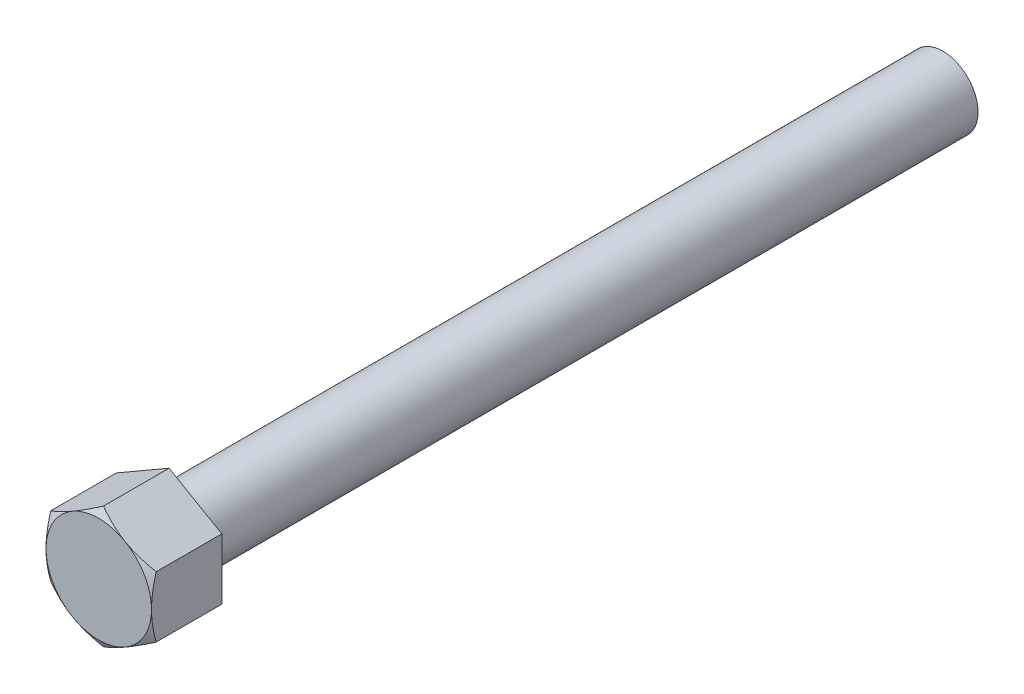
ISO-10303-21;
HEADER;
FILE_DESCRIPTION(('STEP AP214'),'2;1');
FILE_NAME('part.step','',(''),(''),'','','');
FILE_SCHEMA(('AUTOMOTIVE_DESIGN { 1 0 10303 214 1 1 1 1 }'));
ENDSEC;
DATA;
#1=APPLICATION_CONTEXT('core data for automotive mechanical design processes');
#2=APPLICATION_PROTOCOL_DEFINITION('international standard','automotive_design',2000,#1);
#3=PRODUCT_CONTEXT('',#1,'mechanical');
#4=PRODUCT('Part','Part','',(#3));
#5=PRODUCT_RELATED_PRODUCT_CATEGORY('part','',(#4));
#6=PRODUCT_DEFINITION_FORMATION('','',#4);
#7=PRODUCT_DEFINITION_CONTEXT('part definition',#1,'design');
#8=PRODUCT_DEFINITION('design','',#6,#7);
#9=PRODUCT_DEFINITION_SHAPE('','',#8);
#10=(LENGTH_UNIT() NAMED_UNIT(*) SI_UNIT(.MILLI.,.METRE.));
#11=(NAMED_UNIT(*) PLANE_ANGLE_UNIT() SI_UNIT($,.RADIAN.));
#12=(NAMED_UNIT(*) SI_UNIT($,.STERADIAN.) SOLID_ANGLE_UNIT());
#13=UNCERTAINTY_MEASURE_WITH_UNIT(LENGTH_MEASURE(1.E-05),#10,'distance_accuracy_value','');
#14=(GEOMETRIC_REPRESENTATION_CONTEXT(3) GLOBAL_UNCERTAINTY_ASSIGNED_CONTEXT((#13)) GLOBAL_UNIT_ASSIGNED_CONTEXT((#10,
#11,#12)) REPRESENTATION_CONTEXT('',''));
#15=CARTESIAN_POINT('',(0.,0.,0.));
#16=DIRECTION('',(0.,0.,1.));
#17=DIRECTION('',(1.,0.,0.));
#18=AXIS2_PLACEMENT_3D('',#15,#16,#17);
#19=CARTESIAN_POINT('',(15.,8.66025403784432,20.));
#20=DIRECTION('',(-0.5,-0.866025403784439,0.));
#21=DIRECTION('',(0.866025403784439,-0.5,0.));
#22=AXIS2_PLACEMENT_3D('',#19,#20,#21);
#23=PLANE('',#22);
#24=CARTESIAN_POINT('',(15.0002,8.66013856779048,18.6601873705111));
#25=CARTESIAN_POINT('',(14.6705058957662,8.8504875476201,18.7700782102561));
#26=CARTESIAN_POINT('',(14.3395258073717,9.04157899075107,18.8749824106714));
#27=CARTESIAN_POINT('',(13.6749115596439,9.42529420558392,19.0734314180569));
#28=CARTESIAN_POINT('',(13.3412765656162,9.61791845919694,19.1669724889506));
#29=CARTESIAN_POINT('',(12.6707077197452,10.0050715628707,19.3414378523902));
#30=CARTESIAN_POINT('',(12.333767999973,10.1996038007819,19.4223322933979));
#31=CARTESIAN_POINT('',(11.6575472373606,10.5900200401078,19.569767356578));
#32=CARTESIAN_POINT('',(11.3182663292305,10.7859039637476,19.6363087976187));
#33=CARTESIAN_POINT('',(10.6460568576327,11.1740042831264,19.7522076253037));
#34=CARTESIAN_POINT('',(10.3131781995736,11.3661918659643,19.8019486165634));
#35=CARTESIAN_POINT('',(9.64589556983828,11.7514476718675,19.8853532509964));
#36=CARTESIAN_POINT('',(9.31149156892749,11.9445159118115,19.91901658471));
#37=CARTESIAN_POINT('',(8.64212181582283,12.3309767189538,19.969415924292));
#38=CARTESIAN_POINT('',(8.30715720719663,12.5243686259132,19.986172045042));
#39=CARTESIAN_POINT('',(7.63691878660898,12.9113309584607,20.0023966061731));
#40=CARTESIAN_POINT('',(7.30164498452174,13.104901378348,20.0018655807276));
#41=CARTESIAN_POINT('',(6.67485311268778,13.4667798342772,19.9847233870019));
#42=CARTESIAN_POINT('',(6.38329037496756,13.6351136593856,19.970203153951));
#43=CARTESIAN_POINT('',(5.80083556199349,13.971394102447,19.9283628595776));
#44=CARTESIAN_POINT('',(5.50994353564008,14.1393406921672,19.9010418928906));
#45=CARTESIAN_POINT('',(4.92898814775334,14.4747554417508,19.8340764880011));
#46=CARTESIAN_POINT('',(4.63892567103477,14.6422230907661,19.7944218717294));
#47=CARTESIAN_POINT('',(4.06016058267391,14.9763732703288,19.7034848969821));
#48=CARTESIAN_POINT('',(3.77145806484041,15.1430557467157,19.6522017480308));
#49=CARTESIAN_POINT('',(2.89508556123952,15.64902964758,19.4796131352529));
#50=CARTESIAN_POINT('',(2.30995340076267,15.9868558579429,19.3410988217431));
#51=CARTESIAN_POINT('',(1.14841408999654,16.657470891688,19.0267280315248));
#52=CARTESIAN_POINT('',(0.57199206823448,16.9902683011192,18.8509453853822));
#53=CARTESIAN_POINT('',(-0.000200000000111794,17.3206235457426,18.6601873705111));
#54=B_SPLINE_CURVE_WITH_KNOTS('',3,(#24,#25,#26,#27,#28,#29,#30,#31,#32,#33,#34,#35,#36,#37,#38,
#39,#40,#41,#42,#43,#44,#45,#46,#47,#48,#49,#50,#51,#52,#53),.UNSPECIFIED.,.F.,.F.,(4,2,2,2,2,2,
2,2,2,2,2,2,2,2,4),(0.,1.18875411504162,2.37789802800056,3.56980778300393,4.76164951910134,
5.92407379683756,7.08652044780809,8.24758247406074,9.40860862348372,10.4193068498566,
11.4300765712312,12.4416826308653,13.4533574773408,15.5211962051185,17.5849760846241),.UNSPECIFIED.);
#55=CARTESIAN_POINT('',(15.,8.66025403784432,18.6602540378444));
#56=VERTEX_POINT('',#55);
#57=CARTESIAN_POINT('',(7.5,12.9903810567666,20.));
#58=VERTEX_POINT('',#57);
#59=EDGE_CURVE('E111',#56,#58,#54,.T.);
#60=ORIENTED_EDGE('',*,*,#59,.F.);
#61=DIRECTION('',(0.,0.,-1.));
#62=VECTOR('',#61,1.);
#63=CARTESIAN_POINT('',(15.,8.66025403784432,20.));
#64=LINE('',#63,#62);
#65=CARTESIAN_POINT('',(15.,8.66025403784432,0.));
#66=VERTEX_POINT('',#65);
#67=EDGE_CURVE('E60',#56,#66,#64,.T.);
#68=ORIENTED_EDGE('',*,*,#67,.T.);
#69=DIRECTION('',(-0.866025403784439,0.5,0.));
#70=VECTOR('',#69,1.);
#71=CARTESIAN_POINT('',(15.,8.66025403784432,0.));
#72=LINE('',#71,#70);
#73=CARTESIAN_POINT('',(-1.13806302484208E-13,17.3205080756887,0.));
#74=VERTEX_POINT('',#73);
#75=EDGE_CURVE('E118',#66,#74,#72,.T.);
#76=ORIENTED_EDGE('',*,*,#75,.T.);
#77=DIRECTION('',(0.,0.,-1.));
#78=VECTOR('',#77,1.);
#79=CARTESIAN_POINT('',(-1.13806302484208E-13,17.3205080756887,20.));
#80=LINE('',#79,#78);
#81=CARTESIAN_POINT('',(-1.13750978777596E-13,17.3205080756887,18.6602540378444));
#82=VERTEX_POINT('',#81);
#83=EDGE_CURVE('E134',#82,#74,#80,.T.);
#84=ORIENTED_EDGE('',*,*,#83,.F.);
#85=EDGE_CURVE('E119',#58,#82,#54,.T.);
#86=ORIENTED_EDGE('',*,*,#85,.F.);
#87=EDGE_LOOP('',(#60,#68,#76,#84,#86));
#88=FACE_BOUND('',#87,.T.);
#89=ADVANCED_FACE('F36',(#88),#23,.F.);
#90=CARTESIAN_POINT('',(-1.13806302484208E-13,17.3205080756887,20.));
#91=DIRECTION('',(0.500000000000002,-0.866025403784437,0.));
#92=DIRECTION('',(0.866025403784437,0.500000000000002,0.));
#93=AXIS2_PLACEMENT_3D('',#90,#91,#92);
#94=PLANE('',#93);
#95=CARTESIAN_POINT('',(0.00019999999988655,17.3206235457426,18.6601873705111));
#96=CARTESIAN_POINT('',(-0.329494104233912,17.130274565913,18.7700782102561));
#97=CARTESIAN_POINT('',(-0.660474192628411,16.939183122782,18.8749824106714));
#98=CARTESIAN_POINT('',(-1.32508844035613,16.5554679079491,19.0734314180569));
#99=CARTESIAN_POINT('',(-1.65872343438391,16.3628436543361,19.1669724889505));
#100=CARTESIAN_POINT('',(-2.32929228025483,15.9756905506624,19.3414378523902));
#101=CARTESIAN_POINT('',(-2.66623200002712,15.7811583127512,19.4223322933978));
#102=CARTESIAN_POINT('',(-3.34245276263949,15.3907420734253,19.569767356578));
#103=CARTESIAN_POINT('',(-3.68173367076962,15.1948581497854,19.6363087976187));
#104=CARTESIAN_POINT('',(-4.35394314236742,14.8067578304066,19.7522076253037));
#105=CARTESIAN_POINT('',(-4.68682180042644,14.6145702475688,19.8019486165633));
#106=CARTESIAN_POINT('',(-5.3541044301618,14.2293144416655,19.8853532509964));
#107=CARTESIAN_POINT('',(-5.6885084310726,14.0362462017216,19.9190165847099));
#108=CARTESIAN_POINT('',(-6.35787818417725,13.6497853945792,19.9694159242919));
#109=CARTESIAN_POINT('',(-6.69284279280345,13.4563934876199,19.9861720450419));
#110=CARTESIAN_POINT('',(-7.3630812133911,13.0694311550724,20.002396606173));
#111=CARTESIAN_POINT('',(-7.69835501547834,12.8758607351851,20.0018655807276));
#112=CARTESIAN_POINT('',(-8.32514688731229,12.5139822792559,19.9847233870018));
#113=CARTESIAN_POINT('',(-8.61670962503251,12.3456484541474,19.970203153951));
#114=CARTESIAN_POINT('',(-9.19916443800654,12.0093680110861,19.9283628595776));
#115=CARTESIAN_POINT('',(-9.49005646435995,11.8414214213658,19.9010418928905));
#116=CARTESIAN_POINT('',(-10.0710118522467,11.5060066717823,19.8340764880011));
#117=CARTESIAN_POINT('',(-10.3610743289652,11.338539022767,19.7944218717293));
#118=CARTESIAN_POINT('',(-10.9398394173261,11.0043888432043,19.7034848969821));
#119=CARTESIAN_POINT('',(-11.2285419351595,10.8377063668174,19.6522017480307));
#120=CARTESIAN_POINT('',(-12.1049144387604,10.3317324659531,19.4796131352529));
#121=CARTESIAN_POINT('',(-12.6900465992372,9.99390625559026,19.3410988217431));
#122=CARTESIAN_POINT('',(-13.8515859100033,9.32329122184513,19.0267280315248));
#123=CARTESIAN_POINT('',(-14.4280079317653,8.99049381241399,18.8509453853822));
#124=CARTESIAN_POINT('',(-15.0001999999999,8.66013856779059,18.6601873705111));
#125=B_SPLINE_CURVE_WITH_KNOTS('',3,(#95,#96,#97,#98,#99,#100,#101,#102,#103,#104,#105,#106,
#107,#108,#109,#110,#111,#112,#113,#114,#115,#116,#117,#118,#119,#120,#121,#122,#123,#124),
.UNSPECIFIED.,.F.,.F.,(4,2,2,2,2,2,2,2,2,2,2,2,2,2,4),(0.,1.18875411504163,2.37789802800056,
3.56980778300394,4.76164951910135,5.92407379683758,7.0865204478081,8.24758247406077,
9.40860862348375,10.4193068498566,11.4300765712311,12.4416826308652,13.4533574773407,
15.5211962051183,17.5849760846238),.UNSPECIFIED.);
#126=CARTESIAN_POINT('',(-7.50000000000003,12.9903810567666,20.));
#127=VERTEX_POINT('',#126);
#128=EDGE_CURVE('E125',#82,#127,#125,.T.);
#129=ORIENTED_EDGE('',*,*,#128,.F.);
#130=ORIENTED_EDGE('',*,*,#83,.T.);
#131=DIRECTION('',(-0.866025403784437,-0.500000000000002,0.));
#132=VECTOR('',#131,1.);
#133=CARTESIAN_POINT('',(-1.13806302484208E-13,17.3205080756887,0.));
#134=LINE('',#133,#132);
#135=CARTESIAN_POINT('',(-14.9999999999999,8.66025403784443,0.));
#136=VERTEX_POINT('',#135);
#137=EDGE_CURVE('E258',#74,#136,#134,.T.);
#138=ORIENTED_EDGE('',*,*,#137,.T.);
#139=DIRECTION('',(0.,0.,-1.));
#140=VECTOR('',#139,1.);
#141=CARTESIAN_POINT('',(-14.9999999999999,8.66025403784443,20.));
#142=LINE('',#141,#140);
#143=CARTESIAN_POINT('',(-14.9999999999999,8.66025403784443,18.6602540378444));
#144=VERTEX_POINT('',#143);
#145=EDGE_CURVE('E206',#144,#136,#142,.T.);
#146=ORIENTED_EDGE('',*,*,#145,.F.);
#147=EDGE_CURVE('E135',#127,#144,#125,.T.);
#148=ORIENTED_EDGE('',*,*,#147,.F.);
#149=EDGE_LOOP('',(#129,#130,#138,#146,#148));
#150=FACE_BOUND('',#149,.T.);
#151=ADVANCED_FACE('F194',(#150),#94,.F.);
#152=CARTESIAN_POINT('',(-14.9999999999999,8.66025403784443,20.));
#153=DIRECTION('',(1.,0.,0.));
#154=DIRECTION('',(0.,0.,-1.));
#155=AXIS2_PLACEMENT_3D('',#152,#153,#154);
#156=PLANE('',#155);
#157=CARTESIAN_POINT('',(-14.9999999999999,26.6882104151645,10.9848419713221));
#158=CARTESIAN_POINT('',(-14.9999999999999,26.0534534631907,11.3042680390355));
#159=CARTESIAN_POINT('',(-14.9999999999999,25.4176266106806,11.6215895687759));
#160=CARTESIAN_POINT('',(-14.9999999999999,24.1433409398577,12.2510012606334));
#161=CARTESIAN_POINT('',(-14.9999999999999,23.5048819588113,12.5630910930642));
#162=CARTESIAN_POINT('',(-14.9999999999999,22.2236831403423,13.1815735437997));
#163=CARTESIAN_POINT('',(-14.9999999999999,21.580937415798,13.4879539915634));
#164=CARTESIAN_POINT('',(-14.9999999999999,20.291820849304,14.0929739216226));
#165=CARTESIAN_POINT('',(-14.9999999999999,19.6454500756374,14.391613549136));
#166=CARTESIAN_POINT('',(-14.9999999999999,18.3181476553705,14.9930490306353));
#167=CARTESIAN_POINT('',(-14.9999999999999,17.6370092286529,15.295389936916));
#168=CARTESIAN_POINT('',(-14.9999999999999,16.2689851285886,15.8869184217451));
#169=CARTESIAN_POINT('',(-14.9999999999999,15.5820992037292,16.1761054210717));
#170=CARTESIAN_POINT('',(-14.9999999999999,14.2018880703523,16.73753273414));
#171=CARTESIAN_POINT('',(-14.9999999999999,13.508567003613,17.0097831824354));
#172=CARTESIAN_POINT('',(-14.9999999999999,12.1138553779054,17.5327492096592));
#173=CARTESIAN_POINT('',(-14.9999999999999,11.4124656953959,17.7834671029909));
#174=CARTESIAN_POINT('',(-14.9999999999999,10.2757697744006,18.1647160114162));
#175=CARTESIAN_POINT('',(-14.9999999999999,9.84340045939987,18.3039781806151));
#176=CARTESIAN_POINT('',(-14.9999999999999,8.97496101098671,18.5704159332396));
#177=CARTESIAN_POINT('',(-14.9999999999999,8.53889074115993,18.6975910690204));
#178=CARTESIAN_POINT('',(-14.9999999999999,7.22478411395742,19.0581086172801));
#179=CARTESIAN_POINT('',(-14.9999999999999,6.34070648946239,19.2704932765371));
#180=CARTESIAN_POINT('',(-14.9999999999999,5.01159069802838,19.5325182506576));
#181=CARTESIAN_POINT('',(-14.9999999999999,4.57196047092621,19.609990157757));
#182=CARTESIAN_POINT('',(-14.9999999999999,3.689640828067,19.745236066349));
#183=CARTESIAN_POINT('',(-14.9999999999999,3.2469514630377,19.8030103936781));
#184=CARTESIAN_POINT('',(-14.9999999999999,2.35945706629709,19.8971324149605));
#185=CARTESIAN_POINT('',(-14.9999999999999,1.91465291934156,19.9334883896859));
#186=CARTESIAN_POINT('',(-14.9999999999999,1.02376349072511,19.9836264249356));
#187=CARTESIAN_POINT('',(-14.9999999999999,0.577678219644122,19.9974086713471));
#188=CARTESIAN_POINT('',(-14.9999999999999,-0.317926897569894,20.0019422071793));
#189=CARTESIAN_POINT('',(-14.9999999999999,-0.767447632696112,19.9925215880561));
#190=CARTESIAN_POINT('',(-14.9999999999999,-1.66540420548011,19.950618370208));
#191=CARTESIAN_POINT('',(-14.9999999999999,-2.11384003190616,19.9181355337439));
#192=CARTESIAN_POINT('',(-14.9999999999999,-3.00873072168788,19.8311770698999));
#193=CARTESIAN_POINT('',(-14.9999999999999,-3.45518476611227,19.7766930765993));
#194=CARTESIAN_POINT('',(-14.9999999999999,-4.34509961041669,19.6474053372732));
#195=CARTESIAN_POINT('',(-14.9999999999999,-4.78856035883563,19.5726012428093));
#196=CARTESIAN_POINT('',(-14.9999999999999,-6.1294143839626,19.3177167491891));
#197=CARTESIAN_POINT('',(-14.9999999999999,-7.02141611421193,19.1088250702083));
#198=CARTESIAN_POINT('',(-14.9999999999999,-8.347186432401,18.7519674586803));
#199=CARTESIAN_POINT('',(-14.9999999999999,-8.7871167984631,18.6257460031757));
#200=CARTESIAN_POINT('',(-14.9999999999999,-9.66319399060239,18.3607678083799));
#201=CARTESIAN_POINT('',(-14.9999999999999,-10.0993409611198,18.2220115499637));
#202=CARTESIAN_POINT('',(-14.9999999999999,-11.2481044963529,17.8408673321399));
#203=CARTESIAN_POINT('',(-14.9999999999999,-11.9576799086278,17.5893408768793));
#204=CARTESIAN_POINT('',(-14.9999999999999,-13.3684975922332,17.0638980879078));
#205=CARTESIAN_POINT('',(-14.9999999999999,-14.0697388942212,16.7899791783579));
#206=CARTESIAN_POINT('',(-14.9999999999999,-15.465591442358,16.224591775631));
#207=CARTESIAN_POINT('',(-14.9999999999999,-16.1601982237946,15.9331123132896));
#208=CARTESIAN_POINT('',(-14.9999999999999,-17.5434848147333,15.336559241292));
#209=CARTESIAN_POINT('',(-14.9999999999999,-18.2321649017524,15.031486272329));
#210=CARTESIAN_POINT('',(-14.9999999999999,-19.5737003350438,14.4245697493395));
#211=CARTESIAN_POINT('',(-14.9999999999999,-20.226771018235,14.1232006790818));
#212=CARTESIAN_POINT('',(-14.9999999999999,-21.5291945086112,13.5125152347545));
#213=CARTESIAN_POINT('',(-14.9999999999999,-22.1785472421328,13.2031987038843));
#214=CARTESIAN_POINT('',(-14.9999999999999,-23.4728071946343,12.5787289633552));
#215=CARTESIAN_POINT('',(-14.9999999999999,-24.1177207659761,12.2635888920616));
#216=CARTESIAN_POINT('',(-14.9999999999999,-25.4048565291382,11.6279613689396));
#217=CARTESIAN_POINT('',(-14.9999999999999,-26.0470788946707,11.3074742691173));
#218=CARTESIAN_POINT('',(-14.9999999999999,-26.6882104151645,10.9848419713221));
#219=B_SPLINE_CURVE_WITH_KNOTS('',3,(#157,#158,#159,#160,#161,#162,#163,#164,#165,#166,#167,
#168,#169,#170,#171,#172,#173,#174,#175,#176,#177,#178,#179,#180,#181,#182,#183,#184,#185,#186,
#187,#188,#189,#190,#191,#192,#193,#194,#195,#196,#197,#198,#199,#200,#201,#202,#203,#204,#205,
#206,#207,#208,#209,#210,#211,#212,#213,#214,#215,#216,#217,#218),.UNSPECIFIED.,.F.,.F.,(4,2,2,
2,2,2,2,2,2,2,2,2,2,2,2,2,2,2,2,2,2,2,2,2,2,2,2,2,2,2,4),(0.,2.13180427834746,4.26374239554677,
6.39979898769153,8.53581547835313,10.7713806203752,13.0070441086034,15.2413566828369,
17.4754288030587,18.8379894775473,20.2006005950029,22.9253619495866,24.2642176378976,
25.6030511778324,26.9413667571294,28.2796713157849,29.6279210719357,30.9761847268664,
32.3249615413612,33.6737614854262,36.4190501883433,37.7919834514715,39.1648640668406,
41.4228494874169,43.6810950140693,45.9407660766038,48.2003307480744,50.3580254436273,
52.5157627424636,54.6691151971017,56.8223264470152),.UNSPECIFIED.);
#220=CARTESIAN_POINT('',(-15.,0.,20.));
#221=VERTEX_POINT('',#220);
#222=EDGE_CURVE('E188',#144,#221,#219,.T.);
#223=ORIENTED_EDGE('',*,*,#222,.F.);
#224=ORIENTED_EDGE('',*,*,#145,.T.);
#225=DIRECTION('',(0.,-1.,0.));
#226=VECTOR('',#225,1.);
#227=CARTESIAN_POINT('',(-14.9999999999999,8.66025403784443,0.));
#228=LINE('',#227,#226);
#229=CARTESIAN_POINT('',(-14.9999999999999,-8.66025403784443,0.));
#230=VERTEX_POINT('',#229);
#231=EDGE_CURVE('E224',#136,#230,#228,.T.);
#232=ORIENTED_EDGE('',*,*,#231,.T.);
#233=DIRECTION('',(0.,0.,-1.));
#234=VECTOR('',#233,1.);
#235=CARTESIAN_POINT('',(-14.9999999999999,-8.66025403784443,20.));
#236=LINE('',#235,#234);
#237=CARTESIAN_POINT('',(-14.9999999999999,-8.66025403784443,18.6602540378444));
#238=VERTEX_POINT('',#237);
#239=EDGE_CURVE('E222',#238,#230,#236,.T.);
#240=ORIENTED_EDGE('',*,*,#239,.F.);
#241=EDGE_CURVE('E182',#221,#238,#219,.T.);
#242=ORIENTED_EDGE('',*,*,#241,.F.);
#243=EDGE_LOOP('',(#223,#224,#232,#240,#242));
#244=FACE_BOUND('',#243,.T.);
#245=ADVANCED_FACE('F190',(#244),#156,.F.);
#246=CARTESIAN_POINT('',(-14.9999999999999,-8.66025403784443,20.));
#247=DIRECTION('',(0.499999999999997,0.86602540378444,0.));
#248=DIRECTION('',(-0.86602540378444,0.499999999999998,0.));
#249=AXIS2_PLACEMENT_3D('',#246,#247,#248);
#250=PLANE('',#249);
#251=CARTESIAN_POINT('',(-15.0001999999999,-8.66013856779059,18.6601873705111));
#252=CARTESIAN_POINT('',(-14.6705058957661,-8.8504875476202,18.7700782102561));
#253=CARTESIAN_POINT('',(-14.3395258073716,-9.04157899075117,18.8749824106714));
#254=CARTESIAN_POINT('',(-13.6749115596439,-9.42529420558403,19.0734314180569));
#255=CARTESIAN_POINT('',(-13.3412765656161,-9.61791845919705,19.1669724889505));
#256=CARTESIAN_POINT('',(-12.6707077197452,-10.0050715628708,19.3414378523902));
#257=CARTESIAN_POINT('',(-12.3337679999729,-10.199603800782,19.4223322933978));
#258=CARTESIAN_POINT('',(-11.6575472373605,-10.5900200401079,19.569767356578));
#259=CARTESIAN_POINT('',(-11.3182663292304,-10.7859039637477,19.6363087976187));
#260=CARTESIAN_POINT('',(-10.6460568576326,-11.1740042831265,19.7522076253037));
#261=CARTESIAN_POINT('',(-10.3131781995736,-11.3661918659644,19.8019486165634));
#262=CARTESIAN_POINT('',(-9.64589556983822,-11.7514476718676,19.8853532509964));
#263=CARTESIAN_POINT('',(-9.31149156892742,-11.9445159118116,19.9190165847099));
#264=CARTESIAN_POINT('',(-8.64212181582276,-12.3309767189539,19.9694159242919));
#265=CARTESIAN_POINT('',(-8.30715720719656,-12.5243686259133,19.986172045042));
#266=CARTESIAN_POINT('',(-7.63691878660891,-12.9113309584608,20.002396606173));
#267=CARTESIAN_POINT('',(-7.30164498452167,-13.1049013783481,20.0018655807276));
#268=CARTESIAN_POINT('',(-6.67485311268771,-13.4667798342773,19.9847233870019));
#269=CARTESIAN_POINT('',(-6.38329037496748,-13.6351136593857,19.970203153951));
#270=CARTESIAN_POINT('',(-5.80083556199342,-13.9713941024471,19.9283628595776));
#271=CARTESIAN_POINT('',(-5.50994353564001,-14.1393406921673,19.9010418928905));
#272=CARTESIAN_POINT('',(-4.92898814775327,-14.4747554417509,19.8340764880011));
#273=CARTESIAN_POINT('',(-4.6389256710347,-14.6422230907662,19.7944218717294));
#274=CARTESIAN_POINT('',(-4.06016058267384,-14.9763732703289,19.7034848969821));
#275=CARTESIAN_POINT('',(-3.77145806484035,-15.1430557467158,19.6522017480307));
#276=CARTESIAN_POINT('',(-2.89508556123946,-15.6490296475801,19.4796131352529));
#277=CARTESIAN_POINT('',(-2.3099534007626,-15.9868558579429,19.3410988217431));
#278=CARTESIAN_POINT('',(-1.14841408999648,-16.6574708916881,19.0267280315248));
#279=CARTESIAN_POINT('',(-0.57199206823442,-16.9902683011192,18.8509453853821));
#280=CARTESIAN_POINT('',(0.000200000000172147,-17.3206235457426,18.660187370511));
#281=B_SPLINE_CURVE_WITH_KNOTS('',3,(#251,#252,#253,#254,#255,#256,#257,#258,#259,#260,#261,
#262,#263,#264,#265,#266,#267,#268,#269,#270,#271,#272,#273,#274,#275,#276,#277,#278,#279,#280),
.UNSPECIFIED.,.F.,.F.,(4,2,2,2,2,2,2,2,2,2,2,2,2,2,4),(0.,1.18875411504162,2.37789802800056,
3.56980778300393,4.76164951910134,5.92407379683756,7.08652044780808,8.24758247406074,
9.40860862348372,10.4193068498566,11.4300765712312,12.4416826308653,13.4533574773408,
15.5211962051185,17.5849760846241),.UNSPECIFIED.);
#282=CARTESIAN_POINT('',(-7.49999999999996,-12.9903810567666,20.));
#283=VERTEX_POINT('',#282);
#284=EDGE_CURVE('E189',#238,#283,#281,.T.);
#285=ORIENTED_EDGE('',*,*,#284,.F.);
#286=ORIENTED_EDGE('',*,*,#239,.T.);
#287=DIRECTION('',(0.86602540378444,-0.499999999999998,0.));
#288=VECTOR('',#287,1.);
#289=CARTESIAN_POINT('',(-14.9999999999999,-8.66025403784443,0.));
#290=LINE('',#289,#288);
#291=CARTESIAN_POINT('',(1.73488139693327E-13,-17.3205080756888,0.));
#292=VERTEX_POINT('',#291);
#293=EDGE_CURVE('E256',#230,#292,#290,.T.);
#294=ORIENTED_EDGE('',*,*,#293,.T.);
#295=DIRECTION('',(0.,0.,-1.));
#296=VECTOR('',#295,1.);
#297=CARTESIAN_POINT('',(1.73488139693327E-13,-17.3205080756888,20.));
#298=LINE('',#297,#296);
#299=CARTESIAN_POINT('',(1.73606159978955E-13,-17.3205080756888,18.6602540378444));
#300=VERTEX_POINT('',#299);
#301=EDGE_CURVE('E228',#300,#292,#298,.T.);
#302=ORIENTED_EDGE('',*,*,#301,.F.);
#303=EDGE_CURVE('E176',#283,#300,#281,.T.);
#304=ORIENTED_EDGE('',*,*,#303,.F.);
#305=EDGE_LOOP('',(#285,#286,#294,#302,#304));
#306=FACE_BOUND('',#305,.T.);
#307=ADVANCED_FACE('F193',(#306),#250,.F.);
#308=CARTESIAN_POINT('',(1.73488139693327E-13,-17.3205080756888,20.));
#309=DIRECTION('',(-0.5,0.866025403784439,0.));
#310=DIRECTION('',(-0.866025403784439,-0.5,0.));
#311=AXIS2_PLACEMENT_3D('',#308,#309,#310);
#312=PLANE('',#311);
#313=CARTESIAN_POINT('',(-0.000199999999826695,-17.3206235457426,18.660187370511));
#314=CARTESIAN_POINT('',(0.329494104233974,-17.130274565913,18.770078210256));
#315=CARTESIAN_POINT('',(0.660474192628476,-16.9391831227821,18.8749824106714));
#316=CARTESIAN_POINT('',(1.3250884403562,-16.5554679079492,19.0734314180569));
#317=CARTESIAN_POINT('',(1.65872343438398,-16.3628436543362,19.1669724889505));
#318=CARTESIAN_POINT('',(2.32929228025491,-15.9756905506624,19.3414378523901));
#319=CARTESIAN_POINT('',(2.66623200002719,-15.7811583127512,19.4223322933978));
#320=CARTESIAN_POINT('',(3.34245276263957,-15.3907420734253,19.5697673565779));
#321=CARTESIAN_POINT('',(3.6817336707697,-15.1948581497855,19.6363087976186));
#322=CARTESIAN_POINT('',(4.3539431423675,-14.8067578304067,19.7522076253037));
#323=CARTESIAN_POINT('',(4.68682180042653,-14.6145702475688,19.8019486165633));
#324=CARTESIAN_POINT('',(5.35410443016189,-14.2293144416656,19.8853532509963));
#325=CARTESIAN_POINT('',(5.68850843107269,-14.0362462017216,19.9190165847099));
#326=CARTESIAN_POINT('',(6.35787818417735,-13.6497853945793,19.9694159242919));
#327=CARTESIAN_POINT('',(6.69284279280355,-13.4563934876199,19.9861720450419));
#328=CARTESIAN_POINT('',(7.3630812133912,-13.0694311550724,20.002396606173));
#329=CARTESIAN_POINT('',(7.69835501547844,-12.8758607351851,20.0018655807275));
#330=CARTESIAN_POINT('',(8.3251468873124,-12.5139822792559,19.9847233870018));
#331=CARTESIAN_POINT('',(8.61670962503261,-12.3456484541475,19.9702031539509));
#332=CARTESIAN_POINT('',(9.19916443800666,-12.0093680110861,19.9283628595775));
#333=CARTESIAN_POINT('',(9.49005646436006,-11.8414214213659,19.9010418928904));
#334=CARTESIAN_POINT('',(10.0710118522468,-11.5060066717823,19.834076488001));
#335=CARTESIAN_POINT('',(10.3610743289653,-11.338539022767,19.7944218717293));
#336=CARTESIAN_POINT('',(10.9398394173262,-11.0043888432044,19.703484896982));
#337=CARTESIAN_POINT('',(11.2285419351597,-10.8377063668175,19.6522017480307));
#338=CARTESIAN_POINT('',(12.1049144387605,-10.3317324659531,19.4796131352528));
#339=CARTESIAN_POINT('',(12.6900465992374,-9.99390625559032,19.341098821743));
#340=CARTESIAN_POINT('',(13.8515859100035,-9.32329122184519,19.0267280315247));
#341=CARTESIAN_POINT('',(14.4280079317655,-8.99049381241404,18.8509453853821));
#342=CARTESIAN_POINT('',(15.0002000000001,-8.66013856779065,18.660187370511));
#343=B_SPLINE_CURVE_WITH_KNOTS('',3,(#313,#314,#315,#316,#317,#318,#319,#320,#321,#322,#323,
#324,#325,#326,#327,#328,#329,#330,#331,#332,#333,#334,#335,#336,#337,#338,#339,#340,#341,#342),
.UNSPECIFIED.,.F.,.F.,(4,2,2,2,2,2,2,2,2,2,2,2,2,2,4),(0.,1.18875411504163,2.37789802800057,
3.56980778300395,4.76164951910136,5.92407379683759,7.08652044780813,8.24758247406079,
9.40860862348378,10.4193068498566,11.4300765712312,12.4416826308653,13.4533574773407,
15.5211962051184,17.5849760846239),.UNSPECIFIED.);
#344=CARTESIAN_POINT('',(7.5,-12.9903810567666,20.));
#345=VERTEX_POINT('',#344);
#346=EDGE_CURVE('E240',#300,#345,#343,.T.);
#347=ORIENTED_EDGE('',*,*,#346,.F.);
#348=ORIENTED_EDGE('',*,*,#301,.T.);
#349=DIRECTION('',(0.866025403784439,0.5,0.));
#350=VECTOR('',#349,1.);
#351=CARTESIAN_POINT('',(1.73488139693327E-13,-17.3205080756888,0.));
#352=LINE('',#351,#350);
#353=CARTESIAN_POINT('',(15.0000000000001,-8.66025403784448,0.));
#354=VERTEX_POINT('',#353);
#355=EDGE_CURVE('E252',#292,#354,#352,.T.);
#356=ORIENTED_EDGE('',*,*,#355,.T.);
#357=DIRECTION('',(0.,0.,-1.));
#358=VECTOR('',#357,1.);
#359=CARTESIAN_POINT('',(15.0000000000001,-8.66025403784448,20.));
#360=LINE('',#359,#358);
#361=CARTESIAN_POINT('',(15.0000000000001,-8.66025403784448,18.6602540378443));
#362=VERTEX_POINT('',#361);
#363=EDGE_CURVE('E231',#362,#354,#360,.T.);
#364=ORIENTED_EDGE('',*,*,#363,.F.);
#365=EDGE_CURVE('E168',#345,#362,#343,.T.);
#366=ORIENTED_EDGE('',*,*,#365,.F.);
#367=EDGE_LOOP('',(#347,#348,#356,#364,#366));
#368=FACE_BOUND('',#367,.T.);
#369=ADVANCED_FACE('F239',(#368),#312,.F.);
#370=CARTESIAN_POINT('',(15.0000000000001,-8.66025403784448,20.));
#371=DIRECTION('',(-1.,0.,0.));
#372=DIRECTION('',(0.,-1.,0.));
#373=AXIS2_PLACEMENT_3D('',#370,#371,#372);
#374=PLANE('',#373);
#375=CARTESIAN_POINT('',(15.0000000000002,-26.6882104151645,10.984841971322));
#376=CARTESIAN_POINT('',(15.0000000000002,-26.0534534631907,11.3042680390354));
#377=CARTESIAN_POINT('',(15.0000000000002,-25.4176266106806,11.6215895687758));
#378=CARTESIAN_POINT('',(15.0000000000002,-24.1433409398577,12.2510012606333));
#379=CARTESIAN_POINT('',(15.0000000000002,-23.5048819588112,12.5630910930641));
#380=CARTESIAN_POINT('',(15.0000000000002,-22.2236831403423,13.1815735437996));
#381=CARTESIAN_POINT('',(15.0000000000002,-21.580937415798,13.4879539915633));
#382=CARTESIAN_POINT('',(15.0000000000001,-20.291820849304,14.0929739216226));
#383=CARTESIAN_POINT('',(15.0000000000001,-19.6454500756373,14.391613549136));
#384=CARTESIAN_POINT('',(15.0000000000001,-18.3181476553704,14.9930490306352));
#385=CARTESIAN_POINT('',(15.0000000000001,-17.6370092286529,15.2953899369159));
#386=CARTESIAN_POINT('',(15.0000000000001,-16.2689851285886,15.886918421745));
#387=CARTESIAN_POINT('',(15.0000000000001,-15.5820992037291,16.1761054210717));
#388=CARTESIAN_POINT('',(15.0000000000001,-14.2018880703522,16.73753273414));
#389=CARTESIAN_POINT('',(15.0000000000001,-13.508567003613,17.0097831824354));
#390=CARTESIAN_POINT('',(15.0000000000001,-12.1138553779053,17.5327492096591));
#391=CARTESIAN_POINT('',(15.0000000000001,-11.4124656953958,17.7834671029908));
#392=CARTESIAN_POINT('',(15.0000000000001,-10.2757697744005,18.1647160114161));
#393=CARTESIAN_POINT('',(15.0000000000001,-9.84340045939979,18.303978180615));
#394=CARTESIAN_POINT('',(15.0000000000001,-8.97496101098663,18.5704159332396));
#395=CARTESIAN_POINT('',(15.0000000000001,-8.53889074115984,18.6975910690203));
#396=CARTESIAN_POINT('',(15.0000000000001,-7.22478411395733,19.0581086172801));
#397=CARTESIAN_POINT('',(15.0000000000001,-6.34070648946228,19.270493276537));
#398=CARTESIAN_POINT('',(15.,-5.01159069802826,19.5325182506575));
#399=CARTESIAN_POINT('',(15.,-4.57196047092609,19.609990157757));
#400=CARTESIAN_POINT('',(15.,-3.68964082806687,19.7452360663489));
#401=CARTESIAN_POINT('',(15.,-3.24695146303758,19.8030103936781));
#402=CARTESIAN_POINT('',(15.,-2.35945706629696,19.8971324149604));
#403=CARTESIAN_POINT('',(15.,-1.91465291934142,19.9334883896858));
#404=CARTESIAN_POINT('',(15.,-1.02376349072497,19.9836264249355));
#405=CARTESIAN_POINT('',(15.,-0.577678219643978,19.997408671347));
#406=CARTESIAN_POINT('',(15.,0.317926897570044,20.0019422071793));
#407=CARTESIAN_POINT('',(15.,0.767447632696265,19.992521588056));
#408=CARTESIAN_POINT('',(15.,1.66540420548026,19.950618370208));
#409=CARTESIAN_POINT('',(15.,2.11384003190632,19.9181355337438));
#410=CARTESIAN_POINT('',(15.,3.00873072168805,19.8311770698998));
#411=CARTESIAN_POINT('',(15.,3.45518476611244,19.7766930765993));
#412=CARTESIAN_POINT('',(15.,4.34509961041687,19.6474053372732));
#413=CARTESIAN_POINT('',(15.,4.7885603588358,19.5726012428093));
#414=CARTESIAN_POINT('',(15.,6.12941438396278,19.317716749189));
#415=CARTESIAN_POINT('',(15.,7.02141611421212,19.1088250702082));
#416=CARTESIAN_POINT('',(15.,8.3471864324012,18.7519674586802));
#417=CARTESIAN_POINT('',(15.,8.7871167984633,18.6257460031756));
#418=CARTESIAN_POINT('',(15.,9.66319399060259,18.3607678083798));
#419=CARTESIAN_POINT('',(14.9999999999999,10.09934096112,18.2220115499637));
#420=CARTESIAN_POINT('',(14.9999999999999,11.2481044963531,17.8408673321398));
#421=CARTESIAN_POINT('',(14.9999999999999,11.9576799086279,17.5893408768792));
#422=CARTESIAN_POINT('',(14.9999999999999,13.3684975922333,17.0638980879078));
#423=CARTESIAN_POINT('',(14.9999999999999,14.0697388942213,16.7899791783579));
#424=CARTESIAN_POINT('',(14.9999999999999,15.4655914423581,16.224591775631));
#425=CARTESIAN_POINT('',(14.9999999999999,16.1601982237947,15.9331123132895));
#426=CARTESIAN_POINT('',(14.9999999999999,17.5434848147333,15.3365592412919));
#427=CARTESIAN_POINT('',(14.9999999999999,18.2321649017524,15.031486272329));
#428=CARTESIAN_POINT('',(14.9999999999999,19.5737003350438,14.4245697493395));
#429=CARTESIAN_POINT('',(14.9999999999999,20.2267710182349,14.1232006790819));
#430=CARTESIAN_POINT('',(14.9999999999999,21.5291945086111,13.5125152347546));
#431=CARTESIAN_POINT('',(14.9999999999999,22.1785472421328,13.2031987038843));
#432=CARTESIAN_POINT('',(14.9999999999999,23.4728071946342,12.5787289633553));
#433=CARTESIAN_POINT('',(14.9999999999999,24.117720765976,12.2635888920617));
#434=CARTESIAN_POINT('',(14.9999999999999,25.404856529138,11.6279613689397));
#435=CARTESIAN_POINT('',(14.9999999999998,26.0470788946706,11.3074742691174));
#436=CARTESIAN_POINT('',(14.9999999999998,26.6882104151643,10.9848419713222));
#437=B_SPLINE_CURVE_WITH_KNOTS('',3,(#375,#376,#377,#378,#379,#380,#381,#382,#383,#384,#385,
#386,#387,#388,#389,#390,#391,#392,#393,#394,#395,#396,#397,#398,#399,#400,#401,#402,#403,#404,
#405,#406,#407,#408,#409,#410,#411,#412,#413,#414,#415,#416,#417,#418,#419,#420,#421,#422,#423,
#424,#425,#426,#427,#428,#429,#430,#431,#432,#433,#434,#435,#436),.UNSPECIFIED.,.F.,.F.,(4,2,2,
2,2,2,2,2,2,2,2,2,2,2,2,2,2,2,2,2,2,2,2,2,2,2,2,2,2,2,4),(0.,2.13180427834748,4.2637423955468,
6.39979898769156,8.53581547835318,10.7713806203752,13.0070441086035,15.241356682837,
17.4754288030588,18.8379894775474,20.200600595003,22.9253619495867,24.2642176378977,
25.6030511778325,26.9413667571296,28.2796713157851,29.6279210719358,30.9761847268665,
32.3249615413614,33.6737614854264,36.4190501883436,37.7919834514717,39.1648640668408,
41.4228494874171,43.6810950140694,45.9407660766039,48.2003307480744,50.3580254436273,
52.5157627424635,54.6691151971015,56.822326447015),.UNSPECIFIED.);
#438=CARTESIAN_POINT('',(15.,0.,20.));
#439=VERTEX_POINT('',#438);
#440=EDGE_CURVE('E245',#362,#439,#437,.T.);
#441=ORIENTED_EDGE('',*,*,#440,.F.);
#442=ORIENTED_EDGE('',*,*,#363,.T.);
#443=DIRECTION('',(0.,1.,0.));
#444=VECTOR('',#443,1.);
#445=CARTESIAN_POINT('',(15.0000000000001,-8.66025403784448,0.));
#446=LINE('',#445,#444);
#447=EDGE_CURVE('E249',#354,#66,#446,.T.);
#448=ORIENTED_EDGE('',*,*,#447,.T.);
#449=ORIENTED_EDGE('',*,*,#67,.F.);
#450=EDGE_CURVE('E116',#439,#56,#437,.T.);
#451=ORIENTED_EDGE('',*,*,#450,.F.);
#452=EDGE_LOOP('',(#441,#442,#448,#449,#451));
#453=FACE_BOUND('',#452,.T.);
#454=ADVANCED_FACE('F247',(#453),#374,.F.);
#455=CARTESIAN_POINT('',(0.,0.,0.));
#456=DIRECTION('',(0.,0.,1.));
#457=DIRECTION('',(1.,0.,0.));
#458=AXIS2_PLACEMENT_3D('',#455,#456,#457);
#459=PLANE('',#458);
#460=CARTESIAN_POINT('',(0.,0.,0.));
#461=DIRECTION('',(0.,0.,-1.));
#462=DIRECTION('',(-1.,0.,0.));
#463=AXIS2_PLACEMENT_3D('',#460,#461,#462);
#464=CIRCLE('',#463,10.);
#465=CARTESIAN_POINT('',(-10.,0.,0.));
#466=VERTEX_POINT('',#465);
#467=EDGE_CURVE('E12',#466,#466,#464,.T.);
#468=ORIENTED_EDGE('',*,*,#467,.F.);
#469=EDGE_LOOP('',(#468));
#470=FACE_BOUND('',#469,.T.);
#471=ORIENTED_EDGE('',*,*,#75,.F.);
#472=ORIENTED_EDGE('',*,*,#447,.F.);
#473=ORIENTED_EDGE('',*,*,#355,.F.);
#474=ORIENTED_EDGE('',*,*,#293,.F.);
#475=ORIENTED_EDGE('',*,*,#231,.F.);
#476=ORIENTED_EDGE('',*,*,#137,.F.);
#477=EDGE_LOOP('',(#471,#472,#473,#474,#475,#476));
#478=FACE_BOUND('',#477,.T.);
#479=ADVANCED_FACE('F260',(#470,#478),#459,.F.);
#480=CARTESIAN_POINT('',(0.,0.,20.));
#481=DIRECTION('',(0.,0.,-1.));
#482=DIRECTION('',(1.,0.,0.));
#483=AXIS2_PLACEMENT_3D('',#480,#481,#482);
#484=CONICAL_SURFACE('',#483,15.,1.0471975511966);
#485=ORIENTED_EDGE('',*,*,#365,.T.);
#486=ORIENTED_EDGE('',*,*,#440,.T.);
#487=CARTESIAN_POINT('',(0.,0.,20.));
#488=DIRECTION('',(0.,0.,1.));
#489=DIRECTION('',(1.,0.,0.));
#490=AXIS2_PLACEMENT_3D('',#487,#488,#489);
#491=CIRCLE('',#490,15.);
#492=EDGE_CURVE('E40',#345,#439,#491,.T.);
#493=ORIENTED_EDGE('',*,*,#492,.F.);
#494=EDGE_LOOP('',(#485,#486,#493));
#495=FACE_BOUND('',#494,.T.);
#496=ADVANCED_FACE('F153',(#495),#484,.T.);
#497=ORIENTED_EDGE('',*,*,#303,.T.);
#498=ORIENTED_EDGE('',*,*,#346,.T.);
#499=EDGE_CURVE('E219',#283,#345,#491,.T.);
#500=ORIENTED_EDGE('',*,*,#499,.F.);
#501=EDGE_LOOP('',(#497,#498,#500));
#502=FACE_BOUND('',#501,.T.);
#503=ADVANCED_FACE('F262',(#502),#484,.T.);
#504=ORIENTED_EDGE('',*,*,#241,.T.);
#505=ORIENTED_EDGE('',*,*,#284,.T.);
#506=EDGE_CURVE('E214',#221,#283,#491,.T.);
#507=ORIENTED_EDGE('',*,*,#506,.F.);
#508=EDGE_LOOP('',(#504,#505,#507));
#509=FACE_BOUND('',#508,.T.);
#510=ADVANCED_FACE('F215',(#509),#484,.T.);
#511=ORIENTED_EDGE('',*,*,#147,.T.);
#512=ORIENTED_EDGE('',*,*,#222,.T.);
#513=EDGE_CURVE('E129',#127,#221,#491,.T.);
#514=ORIENTED_EDGE('',*,*,#513,.F.);
#515=EDGE_LOOP('',(#511,#512,#514));
#516=FACE_BOUND('',#515,.T.);
#517=ADVANCED_FACE('F210',(#516),#484,.T.);
#518=ORIENTED_EDGE('',*,*,#85,.T.);
#519=ORIENTED_EDGE('',*,*,#128,.T.);
#520=EDGE_CURVE('E45',#58,#127,#491,.T.);
#521=ORIENTED_EDGE('',*,*,#520,.F.);
#522=EDGE_LOOP('',(#518,#519,#521));
#523=FACE_BOUND('',#522,.T.);
#524=ADVANCED_FACE('F123',(#523),#484,.T.);
#525=ORIENTED_EDGE('',*,*,#59,.T.);
#526=CARTESIAN_POINT('',(0.,0.,20.));
#527=DIRECTION('',(0.,0.,1.));
#528=DIRECTION('',(1.,0.,0.));
#529=AXIS2_PLACEMENT_3D('',#526,#527,#528);
#530=CIRCLE('',#529,15.);
#531=EDGE_CURVE('E114',#439,#58,#530,.T.);
#532=ORIENTED_EDGE('',*,*,#531,.F.);
#533=ORIENTED_EDGE('',*,*,#450,.T.);
#534=EDGE_LOOP('',(#525,#532,#533));
#535=FACE_BOUND('',#534,.T.);
#536=ADVANCED_FACE('F113',(#535),#484,.T.);
#537=CARTESIAN_POINT('',(0.,0.,20.));
#538=DIRECTION('',(0.,0.,1.));
#539=DIRECTION('',(1.,0.,0.));
#540=AXIS2_PLACEMENT_3D('',#537,#538,#539);
#541=PLANE('',#540);
#542=ORIENTED_EDGE('',*,*,#492,.T.);
#543=ORIENTED_EDGE('',*,*,#531,.T.);
#544=ORIENTED_EDGE('',*,*,#520,.T.);
#545=ORIENTED_EDGE('',*,*,#513,.T.);
#546=ORIENTED_EDGE('',*,*,#506,.T.);
#547=ORIENTED_EDGE('',*,*,#499,.T.);
#548=EDGE_LOOP('',(#542,#543,#544,#545,#546,#547));
#549=FACE_BOUND('',#548,.T.);
#550=ADVANCED_FACE('F130',(#549),#541,.T.);
#551=CARTESIAN_POINT('',(0.,0.,-220.));
#552=DIRECTION('',(0.,0.,1.));
#553=DIRECTION('',(1.,0.,0.));
#554=AXIS2_PLACEMENT_3D('',#551,#552,#553);
#555=CYLINDRICAL_SURFACE('',#554,10.);
#556=CARTESIAN_POINT('',(0.,0.,-220.));
#557=DIRECTION('',(0.,0.,-1.));
#558=DIRECTION('',(-1.,0.,0.));
#559=AXIS2_PLACEMENT_3D('',#556,#557,#558);
#560=CIRCLE('',#559,10.);
#561=CARTESIAN_POINT('',(-10.,0.,-220.));
#562=VERTEX_POINT('',#561);
#563=EDGE_CURVE('E131',#562,#562,#560,.T.);
#564=ORIENTED_EDGE('',*,*,#563,.F.);
#565=EDGE_LOOP('',(#564));
#566=FACE_BOUND('',#565,.T.);
#567=ORIENTED_EDGE('',*,*,#467,.T.);
#568=EDGE_LOOP('',(#567));
#569=FACE_BOUND('',#568,.T.);
#570=ADVANCED_FACE('F154',(#566,#569),#555,.T.);
#571=CARTESIAN_POINT('',(0.,0.,-220.));
#572=DIRECTION('',(0.,0.,-1.));
#573=DIRECTION('',(-1.,0.,0.));
#574=AXIS2_PLACEMENT_3D('',#571,#572,#573);
#575=PLANE('',#574);
#576=ORIENTED_EDGE('',*,*,#563,.T.);
#577=EDGE_LOOP('',(#576));
#578=FACE_BOUND('',#577,.T.);
#579=ADVANCED_FACE('F340',(#578),#575,.T.);
#580=CLOSED_SHELL('',(#89,#151,#245,#307,#369,#454,#479,#496,#503,#510,#517,#524,#536,#550,#570,#579));
#581=MANIFOLD_SOLID_BREP('B2',#580);
#582=ADVANCED_BREP_SHAPE_REPRESENTATION('',(#18,#581),#14);
#583=SHAPE_DEFINITION_REPRESENTATION(#9,#582);
ENDSEC;
END-ISO-10303-21;
